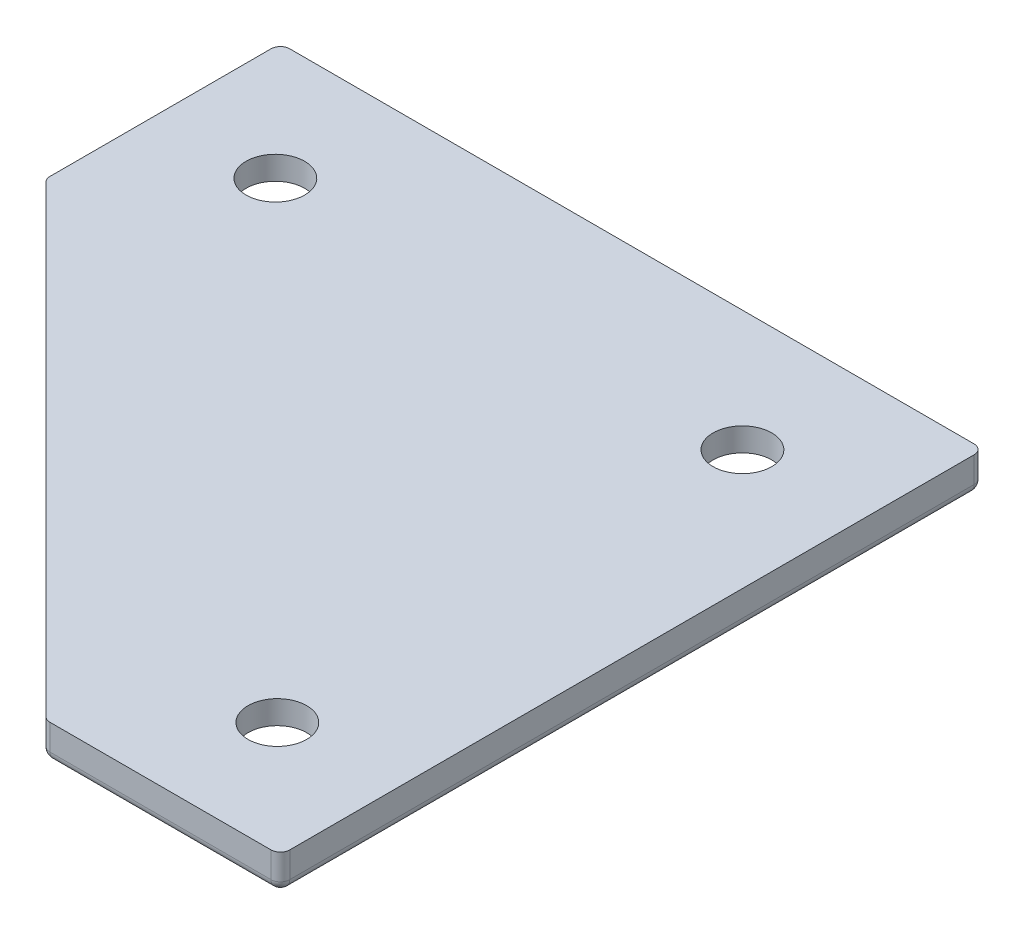
ISO-10303-21;
HEADER;
FILE_DESCRIPTION(('STEP AP214'),'2;1');
FILE_NAME('part.step','',(''),(''),'','','');
FILE_SCHEMA(('AUTOMOTIVE_DESIGN { 1 0 10303 214 1 1 1 1 }'));
ENDSEC;
DATA;
#1=APPLICATION_CONTEXT('core data for automotive mechanical design processes');
#2=APPLICATION_PROTOCOL_DEFINITION('international standard','automotive_design',2000,#1);
#3=PRODUCT_CONTEXT('',#1,'mechanical');
#4=PRODUCT('Part','Part','',(#3));
#5=PRODUCT_RELATED_PRODUCT_CATEGORY('part','',(#4));
#6=PRODUCT_DEFINITION_FORMATION('','',#4);
#7=PRODUCT_DEFINITION_CONTEXT('part definition',#1,'design');
#8=PRODUCT_DEFINITION('design','',#6,#7);
#9=PRODUCT_DEFINITION_SHAPE('','',#8);
#10=(LENGTH_UNIT() NAMED_UNIT(*) SI_UNIT(.MILLI.,.METRE.));
#11=(NAMED_UNIT(*) PLANE_ANGLE_UNIT() SI_UNIT($,.RADIAN.));
#12=(NAMED_UNIT(*) SI_UNIT($,.STERADIAN.) SOLID_ANGLE_UNIT());
#13=UNCERTAINTY_MEASURE_WITH_UNIT(LENGTH_MEASURE(1.E-05),#10,'distance_accuracy_value','');
#14=(GEOMETRIC_REPRESENTATION_CONTEXT(3) GLOBAL_UNCERTAINTY_ASSIGNED_CONTEXT((#13)) GLOBAL_UNIT_ASSIGNED_CONTEXT((#10,
#11,#12)) REPRESENTATION_CONTEXT('',''));
#15=CARTESIAN_POINT('',(0.,0.,0.));
#16=DIRECTION('',(0.,0.,1.));
#17=DIRECTION('',(1.,0.,0.));
#18=AXIS2_PLACEMENT_3D('',#15,#16,#17);
#19=CARTESIAN_POINT('',(12.941413138682,0.,-19.4540886632808));
#20=DIRECTION('',(0.,-1.,0.));
#21=DIRECTION('',(1.,0.,0.));
#22=AXIS2_PLACEMENT_3D('',#19,#20,#21);
#23=CYLINDRICAL_SURFACE('',#22,2.5);
#24=CARTESIAN_POINT('',(12.941413138682,0.,-19.4540886632808));
#25=DIRECTION('',(0.,-1.,0.));
#26=DIRECTION('',(1.,0.,0.));
#27=AXIS2_PLACEMENT_3D('',#24,#25,#26);
#28=CIRCLE('',#27,2.5);
#29=CARTESIAN_POINT('',(15.441413138682,0.,-19.4540886632808));
#30=VERTEX_POINT('',#29);
#31=EDGE_CURVE('E11',#30,#30,#28,.T.);
#32=ORIENTED_EDGE('',*,*,#31,.F.);
#33=EDGE_LOOP('',(#32));
#34=FACE_BOUND('',#33,.T.);
#35=CARTESIAN_POINT('',(12.941413138682,-2.,-19.4540886632808));
#36=DIRECTION('',(0.,-1.,0.));
#37=DIRECTION('',(1.,0.,0.));
#38=AXIS2_PLACEMENT_3D('',#35,#36,#37);
#39=CIRCLE('',#38,2.5);
#40=CARTESIAN_POINT('',(15.441413138682,-2.,-19.4540886632808));
#41=VERTEX_POINT('',#40);
#42=EDGE_CURVE('E24',#41,#41,#39,.T.);
#43=ORIENTED_EDGE('',*,*,#42,.T.);
#44=EDGE_LOOP('',(#43));
#45=FACE_BOUND('',#44,.T.);
#46=ADVANCED_FACE('F17',(#34,#45),#23,.F.);
#47=CARTESIAN_POINT('',(52.9409032156974,0.,-19.3106041997538));
#48=DIRECTION('',(0.,-1.,0.));
#49=DIRECTION('',(1.,0.,0.));
#50=AXIS2_PLACEMENT_3D('',#47,#48,#49);
#51=CYLINDRICAL_SURFACE('',#50,2.5);
#52=CARTESIAN_POINT('',(52.9409032156974,0.,-19.3106041997538));
#53=DIRECTION('',(0.,-1.,0.));
#54=DIRECTION('',(1.,0.,0.));
#55=AXIS2_PLACEMENT_3D('',#52,#53,#54);
#56=CIRCLE('',#55,2.5);
#57=CARTESIAN_POINT('',(55.4409032156974,0.,-19.3106041997538));
#58=VERTEX_POINT('',#57);
#59=EDGE_CURVE('E201',#58,#58,#56,.T.);
#60=ORIENTED_EDGE('',*,*,#59,.F.);
#61=EDGE_LOOP('',(#60));
#62=FACE_BOUND('',#61,.T.);
#63=CARTESIAN_POINT('',(52.9409032156974,-2.,-19.3106041997538));
#64=DIRECTION('',(0.,-1.,0.));
#65=DIRECTION('',(1.,0.,0.));
#66=AXIS2_PLACEMENT_3D('',#63,#64,#65);
#67=CIRCLE('',#66,2.5);
#68=CARTESIAN_POINT('',(55.4409032156974,-2.,-19.3106041997538));
#69=VERTEX_POINT('',#68);
#70=EDGE_CURVE('E198',#69,#69,#67,.T.);
#71=ORIENTED_EDGE('',*,*,#70,.T.);
#72=EDGE_LOOP('',(#71));
#73=FACE_BOUND('',#72,.T.);
#74=ADVANCED_FACE('F333',(#62,#73),#51,.F.);
#75=CARTESIAN_POINT('',(53.2561390023041,0.,20.6893958002462));
#76=DIRECTION('',(0.,-1.,0.));
#77=DIRECTION('',(1.,0.,0.));
#78=AXIS2_PLACEMENT_3D('',#75,#76,#77);
#79=CYLINDRICAL_SURFACE('',#78,2.5);
#80=CARTESIAN_POINT('',(53.2561390023041,0.,20.6893958002462));
#81=DIRECTION('',(0.,-1.,0.));
#82=DIRECTION('',(1.,0.,0.));
#83=AXIS2_PLACEMENT_3D('',#80,#81,#82);
#84=CIRCLE('',#83,2.5);
#85=CARTESIAN_POINT('',(55.7561390023041,0.,20.6893958002462));
#86=VERTEX_POINT('',#85);
#87=EDGE_CURVE('E195',#86,#86,#84,.T.);
#88=ORIENTED_EDGE('',*,*,#87,.F.);
#89=EDGE_LOOP('',(#88));
#90=FACE_BOUND('',#89,.T.);
#91=CARTESIAN_POINT('',(53.2561390023041,-2.,20.6893958002462));
#92=DIRECTION('',(0.,-1.,0.));
#93=DIRECTION('',(1.,0.,0.));
#94=AXIS2_PLACEMENT_3D('',#91,#92,#93);
#95=CIRCLE('',#94,2.5);
#96=CARTESIAN_POINT('',(55.7561390023041,-2.,20.6893958002462));
#97=VERTEX_POINT('',#96);
#98=EDGE_CURVE('E192',#97,#97,#95,.T.);
#99=ORIENTED_EDGE('',*,*,#98,.T.);
#100=EDGE_LOOP('',(#99));
#101=FACE_BOUND('',#100,.T.);
#102=ADVANCED_FACE('F330',(#90,#101),#79,.F.);
#103=CARTESIAN_POINT('',(63.1954992182265,-3.,30.3719008264463));
#104=DIRECTION('',(0.,0.,-1.));
#105=DIRECTION('',(1.,0.,0.));
#106=AXIS2_PLACEMENT_3D('',#103,#104,#105);
#107=PLANE('',#106);
#108=DIRECTION('',(-1.,0.,0.));
#109=VECTOR('',#108,1.);
#110=CARTESIAN_POINT('',(63.1954992182265,0.,30.3719008264463));
#111=LINE('',#110,#109);
#112=CARTESIAN_POINT('',(62.3954992182265,0.,30.3719008264463));
#113=VERTEX_POINT('',#112);
#114=CARTESIAN_POINT('',(43.526870068125,0.,30.3719008264463));
#115=VERTEX_POINT('',#114);
#116=EDGE_CURVE('E31',#113,#115,#111,.T.);
#117=ORIENTED_EDGE('',*,*,#116,.T.);
#118=DIRECTION('',(0.,1.,0.));
#119=VECTOR('',#118,1.);
#120=CARTESIAN_POINT('',(43.526870068125,-3.,30.3719008264463));
#121=LINE('',#120,#119);
#122=CARTESIAN_POINT('',(43.526870068125,-2.2,30.3719008264463));
#123=VERTEX_POINT('',#122);
#124=EDGE_CURVE('E36',#115,#123,#121,.F.);
#125=ORIENTED_EDGE('',*,*,#124,.T.);
#126=DIRECTION('',(-1.,0.,0.));
#127=VECTOR('',#126,1.);
#128=CARTESIAN_POINT('',(63.1954992182265,-2.2,30.3719008264463));
#129=LINE('',#128,#127);
#130=CARTESIAN_POINT('',(62.3954992182265,-2.2,30.3719008264463));
#131=VERTEX_POINT('',#130);
#132=EDGE_CURVE('E188',#123,#131,#129,.F.);
#133=ORIENTED_EDGE('',*,*,#132,.T.);
#134=DIRECTION('',(0.,1.,0.));
#135=VECTOR('',#134,1.);
#136=CARTESIAN_POINT('',(62.3954992182265,-3.,30.3719008264463));
#137=LINE('',#136,#135);
#138=EDGE_CURVE('E186',#131,#113,#137,.T.);
#139=ORIENTED_EDGE('',*,*,#138,.T.);
#140=EDGE_LOOP('',(#117,#125,#133,#139));
#141=FACE_BOUND('',#140,.T.);
#142=ADVANCED_FACE('F306',(#141),#107,.F.);
#143=CARTESIAN_POINT('',(43.1954992182265,-3.,30.3719008264463));
#144=DIRECTION('',(0.707106781186547,0.,-0.707106781186547));
#145=DIRECTION('',(0.707106781186548,0.,0.707106781186548));
#146=AXIS2_PLACEMENT_3D('',#143,#144,#145);
#147=PLANE('',#146);
#148=DIRECTION('',(-0.707106781186548,0.,-0.707106781186548));
#149=VECTOR('',#148,1.);
#150=CARTESIAN_POINT('',(43.1954992182265,-2.2,30.3719008264463));
#151=LINE('',#150,#149);
#152=CARTESIAN_POINT('',(3.42981379327726,-2.2,-9.39378459850293));
#153=VERTEX_POINT('',#152);
#154=CARTESIAN_POINT('',(42.9611846431757,-2.2,30.1375862513956));
#155=VERTEX_POINT('',#154);
#156=EDGE_CURVE('E184',#153,#155,#151,.F.);
#157=ORIENTED_EDGE('',*,*,#156,.T.);
#158=DIRECTION('',(0.,1.,0.));
#159=VECTOR('',#158,1.);
#160=CARTESIAN_POINT('',(42.9611846431757,-3.,30.1375862513956));
#161=LINE('',#160,#159);
#162=CARTESIAN_POINT('',(42.9611846431757,0.,30.1375862513956));
#163=VERTEX_POINT('',#162);
#164=EDGE_CURVE('E182',#155,#163,#161,.T.);
#165=ORIENTED_EDGE('',*,*,#164,.T.);
#166=DIRECTION('',(-0.707106781186548,0.,-0.707106781186548));
#167=VECTOR('',#166,1.);
#168=CARTESIAN_POINT('',(43.1954992182265,0.,30.3719008264463));
#169=LINE('',#168,#167);
#170=CARTESIAN_POINT('',(3.42981379327721,0.,-9.39378459850299));
#171=VERTEX_POINT('',#170);
#172=EDGE_CURVE('E180',#163,#171,#169,.T.);
#173=ORIENTED_EDGE('',*,*,#172,.T.);
#174=DIRECTION('',(0.,1.,0.));
#175=VECTOR('',#174,1.);
#176=CARTESIAN_POINT('',(3.42981379327726,-3.,-9.39378459850294));
#177=LINE('',#176,#175);
#178=EDGE_CURVE('E178',#171,#153,#177,.F.);
#179=ORIENTED_EDGE('',*,*,#178,.T.);
#180=EDGE_LOOP('',(#157,#165,#173,#179));
#181=FACE_BOUND('',#180,.T.);
#182=ADVANCED_FACE('F321',(#181),#147,.F.);
#183=CARTESIAN_POINT('',(3.1954992182265,-3.,-29.6280991735537));
#184=DIRECTION('',(1.,0.,0.));
#185=DIRECTION('',(0.,1.,0.));
#186=AXIS2_PLACEMENT_3D('',#183,#184,#185);
#187=PLANE('',#186);
#188=CARTESIAN_POINT('',(3.1954992182265,-2.2,-10.7594700234522));
#189=DIRECTION('',(1.,0.,0.));
#190=DIRECTION('',(0.,0.,-1.));
#191=AXIS2_PLACEMENT_3D('',#188,#189,#190);
#192=ELLIPSE('',#191,1.13137084989848,0.8);
#193=CARTESIAN_POINT('',(3.1954992182265,-3.,-10.7594700234522));
#194=VERTEX_POINT('',#193);
#195=CARTESIAN_POINT('',(3.1954992182265,-2.76568542494924,-9.95947002345218));
#196=VERTEX_POINT('',#195);
#197=EDGE_CURVE('E176',#194,#196,#192,.F.);
#198=ORIENTED_EDGE('',*,*,#197,.T.);
#199=DIRECTION('',(0.,1.,0.));
#200=VECTOR('',#199,1.);
#201=CARTESIAN_POINT('',(3.1954992182265,-3.,-9.95947002345218));
#202=LINE('',#201,#200);
#203=CARTESIAN_POINT('',(3.1954992182265,0.,-9.95947002345218));
#204=VERTEX_POINT('',#203);
#205=EDGE_CURVE('E174',#196,#204,#202,.T.);
#206=ORIENTED_EDGE('',*,*,#205,.T.);
#207=DIRECTION('',(0.,0.,-1.));
#208=VECTOR('',#207,1.);
#209=CARTESIAN_POINT('',(3.1954992182265,0.,-29.6280991735537));
#210=LINE('',#209,#208);
#211=CARTESIAN_POINT('',(3.1954992182265,0.,-28.8280991735537));
#212=VERTEX_POINT('',#211);
#213=EDGE_CURVE('E172',#204,#212,#210,.T.);
#214=ORIENTED_EDGE('',*,*,#213,.T.);
#215=DIRECTION('',(0.,1.,0.));
#216=VECTOR('',#215,1.);
#217=CARTESIAN_POINT('',(3.1954992182265,-3.,-28.8280991735537));
#218=LINE('',#217,#216);
#219=CARTESIAN_POINT('',(3.1954992182265,-3.,-28.8280991735537));
#220=VERTEX_POINT('',#219);
#221=EDGE_CURVE('E170',#212,#220,#218,.F.);
#222=ORIENTED_EDGE('',*,*,#221,.T.);
#223=DIRECTION('',(0.,0.,-1.));
#224=VECTOR('',#223,1.);
#225=CARTESIAN_POINT('',(3.1954992182265,-3.,-29.6280991735537));
#226=LINE('',#225,#224);
#227=EDGE_CURVE('E168',#194,#220,#226,.T.);
#228=ORIENTED_EDGE('',*,*,#227,.F.);
#229=EDGE_LOOP('',(#198,#206,#214,#222,#228));
#230=FACE_BOUND('',#229,.T.);
#231=ADVANCED_FACE('F314',(#230),#187,.F.);
#232=CARTESIAN_POINT('',(63.1954992182265,-3.,-29.6280991735537));
#233=DIRECTION('',(0.,0.,1.));
#234=DIRECTION('',(-1.,0.,0.));
#235=AXIS2_PLACEMENT_3D('',#232,#233,#234);
#236=PLANE('',#235);
#237=DIRECTION('',(1.,0.,0.));
#238=VECTOR('',#237,1.);
#239=CARTESIAN_POINT('',(63.1954992182265,-2.2,-29.6280991735537));
#240=LINE('',#239,#238);
#241=CARTESIAN_POINT('',(62.3954992182265,-2.2,-29.6280991735537));
#242=VERTEX_POINT('',#241);
#243=CARTESIAN_POINT('',(3.9954992182265,-2.2,-29.6280991735537));
#244=VERTEX_POINT('',#243);
#245=EDGE_CURVE('E166',#242,#244,#240,.F.);
#246=ORIENTED_EDGE('',*,*,#245,.T.);
#247=DIRECTION('',(0.,1.,0.));
#248=VECTOR('',#247,1.);
#249=CARTESIAN_POINT('',(3.9954992182265,-3.,-29.6280991735537));
#250=LINE('',#249,#248);
#251=CARTESIAN_POINT('',(3.9954992182265,0.,-29.6280991735537));
#252=VERTEX_POINT('',#251);
#253=EDGE_CURVE('E164',#244,#252,#250,.T.);
#254=ORIENTED_EDGE('',*,*,#253,.T.);
#255=DIRECTION('',(1.,0.,0.));
#256=VECTOR('',#255,1.);
#257=CARTESIAN_POINT('',(63.1954992182265,0.,-29.6280991735537));
#258=LINE('',#257,#256);
#259=CARTESIAN_POINT('',(62.3954992182265,0.,-29.6280991735537));
#260=VERTEX_POINT('',#259);
#261=EDGE_CURVE('E162',#252,#260,#258,.T.);
#262=ORIENTED_EDGE('',*,*,#261,.T.);
#263=DIRECTION('',(0.,1.,0.));
#264=VECTOR('',#263,1.);
#265=CARTESIAN_POINT('',(62.3954992182265,-3.,-29.6280991735537));
#266=LINE('',#265,#264);
#267=EDGE_CURVE('E160',#260,#242,#266,.F.);
#268=ORIENTED_EDGE('',*,*,#267,.T.);
#269=EDGE_LOOP('',(#246,#254,#262,#268));
#270=FACE_BOUND('',#269,.T.);
#271=ADVANCED_FACE('F292',(#270),#236,.F.);
#272=CARTESIAN_POINT('',(63.1954992182265,-3.,30.3719008264463));
#273=DIRECTION('',(-1.,0.,0.));
#274=DIRECTION('',(0.,-1.,0.));
#275=AXIS2_PLACEMENT_3D('',#272,#273,#274);
#276=PLANE('',#275);
#277=DIRECTION('',(0.,0.,1.));
#278=VECTOR('',#277,1.);
#279=CARTESIAN_POINT('',(63.1954992182265,0.,30.3719008264463));
#280=LINE('',#279,#278);
#281=CARTESIAN_POINT('',(63.1954992182265,0.,-28.8280991735537));
#282=VERTEX_POINT('',#281);
#283=CARTESIAN_POINT('',(63.1954992182265,0.,29.5719008264463));
#284=VERTEX_POINT('',#283);
#285=EDGE_CURVE('E158',#282,#284,#280,.T.);
#286=ORIENTED_EDGE('',*,*,#285,.T.);
#287=DIRECTION('',(0.,1.,0.));
#288=VECTOR('',#287,1.);
#289=CARTESIAN_POINT('',(63.1954992182265,-3.,29.5719008264463));
#290=LINE('',#289,#288);
#291=CARTESIAN_POINT('',(63.1954992182265,-2.2,29.5719008264463));
#292=VERTEX_POINT('',#291);
#293=EDGE_CURVE('E156',#284,#292,#290,.F.);
#294=ORIENTED_EDGE('',*,*,#293,.T.);
#295=DIRECTION('',(0.,0.,1.));
#296=VECTOR('',#295,1.);
#297=CARTESIAN_POINT('',(63.1954992182265,-2.2,30.3719008264463));
#298=LINE('',#297,#296);
#299=CARTESIAN_POINT('',(63.1954992182265,-2.2,-28.8280991735537));
#300=VERTEX_POINT('',#299);
#301=EDGE_CURVE('E123',#292,#300,#298,.F.);
#302=ORIENTED_EDGE('',*,*,#301,.T.);
#303=DIRECTION('',(0.,1.,0.));
#304=VECTOR('',#303,1.);
#305=CARTESIAN_POINT('',(63.1954992182265,-3.,-28.8280991735537));
#306=LINE('',#305,#304);
#307=EDGE_CURVE('E153',#300,#282,#306,.T.);
#308=ORIENTED_EDGE('',*,*,#307,.T.);
#309=EDGE_LOOP('',(#286,#294,#302,#308));
#310=FACE_BOUND('',#309,.T.);
#311=ADVANCED_FACE('F302',(#310),#276,.F.);
#312=CARTESIAN_POINT('',(0.,-3.,0.));
#313=DIRECTION('',(0.,1.,0.));
#314=DIRECTION('',(-1.,0.,0.));
#315=AXIS2_PLACEMENT_3D('',#312,#313,#314);
#316=PLANE('',#315);
#317=CARTESIAN_POINT('',(53.2561390023041,-3.,20.6893958002462));
#318=DIRECTION('',(0.,1.,0.));
#319=DIRECTION('',(0.,0.,1.));
#320=AXIS2_PLACEMENT_3D('',#317,#318,#319);
#321=CIRCLE('',#320,5.05);
#322=CARTESIAN_POINT('',(53.2561390023041,-3.,25.7393958002462));
#323=VERTEX_POINT('',#322);
#324=EDGE_CURVE('E150',#323,#323,#321,.T.);
#325=ORIENTED_EDGE('',*,*,#324,.T.);
#326=EDGE_LOOP('',(#325));
#327=FACE_BOUND('',#326,.T.);
#328=CARTESIAN_POINT('',(52.9409032156974,-3.,-19.3106041997538));
#329=DIRECTION('',(0.,1.,0.));
#330=DIRECTION('',(0.,0.,1.));
#331=AXIS2_PLACEMENT_3D('',#328,#329,#330);
#332=CIRCLE('',#331,5.05);
#333=CARTESIAN_POINT('',(52.9409032156974,-3.,-14.2606041997538));
#334=VERTEX_POINT('',#333);
#335=EDGE_CURVE('E143',#334,#334,#332,.T.);
#336=ORIENTED_EDGE('',*,*,#335,.T.);
#337=EDGE_LOOP('',(#336));
#338=FACE_BOUND('',#337,.T.);
#339=CARTESIAN_POINT('',(12.941413138682,-3.,-19.4540886632808));
#340=DIRECTION('',(0.,1.,0.));
#341=DIRECTION('',(0.,0.,1.));
#342=AXIS2_PLACEMENT_3D('',#339,#340,#341);
#343=CIRCLE('',#342,5.05);
#344=CARTESIAN_POINT('',(12.941413138682,-3.,-14.4040886632808));
#345=VERTEX_POINT('',#344);
#346=EDGE_CURVE('E139',#345,#345,#343,.T.);
#347=ORIENTED_EDGE('',*,*,#346,.T.);
#348=EDGE_LOOP('',(#347));
#349=FACE_BOUND('',#348,.T.);
#350=DIRECTION('',(-1.,0.,0.));
#351=VECTOR('',#350,1.);
#352=CARTESIAN_POINT('',(0.,-3.,29.5719008264463));
#353=LINE('',#352,#351);
#354=CARTESIAN_POINT('',(62.3954992182265,-3.,29.5719008264463));
#355=VERTEX_POINT('',#354);
#356=CARTESIAN_POINT('',(43.526870068125,-3.,29.5719008264463));
#357=VERTEX_POINT('',#356);
#358=EDGE_CURVE('E108',#355,#357,#353,.T.);
#359=ORIENTED_EDGE('',*,*,#358,.T.);
#360=DIRECTION('',(-0.707106781186548,0.,-0.707106781186548));
#361=VECTOR('',#360,1.);
#362=CARTESIAN_POINT('',(6.97748462083934,-3.,-6.97748462083934));
#363=LINE('',#362,#361);
#364=EDGE_CURVE('E140',#357,#194,#363,.T.);
#365=ORIENTED_EDGE('',*,*,#364,.T.);
#366=ORIENTED_EDGE('',*,*,#227,.T.);
#367=DIRECTION('',(1.,0.,0.));
#368=VECTOR('',#367,1.);
#369=CARTESIAN_POINT('',(0.,-3.,-28.8280991735537));
#370=LINE('',#369,#368);
#371=CARTESIAN_POINT('',(62.3954992182265,-3.,-28.8280991735537));
#372=VERTEX_POINT('',#371);
#373=EDGE_CURVE('E112',#220,#372,#370,.T.);
#374=ORIENTED_EDGE('',*,*,#373,.T.);
#375=DIRECTION('',(0.,0.,1.));
#376=VECTOR('',#375,1.);
#377=CARTESIAN_POINT('',(62.3954992182265,-3.,0.));
#378=LINE('',#377,#376);
#379=EDGE_CURVE('E103',#372,#355,#378,.T.);
#380=ORIENTED_EDGE('',*,*,#379,.T.);
#381=EDGE_LOOP('',(#359,#365,#366,#374,#380));
#382=FACE_BOUND('',#381,.T.);
#383=ADVANCED_FACE('F105',(#327,#338,#349,#382),#316,.F.);
#384=CARTESIAN_POINT('',(0.,0.,0.));
#385=DIRECTION('',(0.,1.,0.));
#386=DIRECTION('',(-1.,0.,0.));
#387=AXIS2_PLACEMENT_3D('',#384,#385,#386);
#388=PLANE('',#387);
#389=ORIENTED_EDGE('',*,*,#87,.T.);
#390=EDGE_LOOP('',(#389));
#391=FACE_BOUND('',#390,.T.);
#392=ORIENTED_EDGE('',*,*,#59,.T.);
#393=EDGE_LOOP('',(#392));
#394=FACE_BOUND('',#393,.T.);
#395=ORIENTED_EDGE('',*,*,#31,.T.);
#396=EDGE_LOOP('',(#395));
#397=FACE_BOUND('',#396,.T.);
#398=ORIENTED_EDGE('',*,*,#172,.F.);
#399=CARTESIAN_POINT('',(43.526870068125,0.,29.5719008264463));
#400=DIRECTION('',(0.,1.,0.));
#401=DIRECTION('',(0.,0.,1.));
#402=AXIS2_PLACEMENT_3D('',#399,#400,#401);
#403=CIRCLE('',#402,0.8);
#404=EDGE_CURVE('E116',#163,#115,#403,.T.);
#405=ORIENTED_EDGE('',*,*,#404,.T.);
#406=ORIENTED_EDGE('',*,*,#116,.F.);
#407=CARTESIAN_POINT('',(62.3954992182265,0.,29.5719008264463));
#408=DIRECTION('',(0.,1.,0.));
#409=DIRECTION('',(0.,0.,1.));
#410=AXIS2_PLACEMENT_3D('',#407,#408,#409);
#411=CIRCLE('',#410,0.8);
#412=EDGE_CURVE('E248',#113,#284,#411,.T.);
#413=ORIENTED_EDGE('',*,*,#412,.T.);
#414=ORIENTED_EDGE('',*,*,#285,.F.);
#415=CARTESIAN_POINT('',(62.3954992182265,0.,-28.8280991735537));
#416=DIRECTION('',(0.,1.,0.));
#417=DIRECTION('',(0.,0.,1.));
#418=AXIS2_PLACEMENT_3D('',#415,#416,#417);
#419=CIRCLE('',#418,0.8);
#420=EDGE_CURVE('E245',#282,#260,#419,.T.);
#421=ORIENTED_EDGE('',*,*,#420,.T.);
#422=ORIENTED_EDGE('',*,*,#261,.F.);
#423=CARTESIAN_POINT('',(3.9954992182265,0.,-28.8280991735537));
#424=DIRECTION('',(0.,1.,0.));
#425=DIRECTION('',(0.,0.,1.));
#426=AXIS2_PLACEMENT_3D('',#423,#424,#425);
#427=CIRCLE('',#426,0.8);
#428=EDGE_CURVE('E242',#252,#212,#427,.T.);
#429=ORIENTED_EDGE('',*,*,#428,.T.);
#430=ORIENTED_EDGE('',*,*,#213,.F.);
#431=CARTESIAN_POINT('',(3.9954992182265,0.,-9.95947002345218));
#432=DIRECTION('',(0.,1.,0.));
#433=DIRECTION('',(0.,0.,1.));
#434=AXIS2_PLACEMENT_3D('',#431,#432,#433);
#435=CIRCLE('',#434,0.8);
#436=EDGE_CURVE('E239',#204,#171,#435,.T.);
#437=ORIENTED_EDGE('',*,*,#436,.T.);
#438=EDGE_LOOP('',(#398,#405,#406,#413,#414,#421,#422,#429,#430,#437));
#439=FACE_BOUND('',#438,.T.);
#440=ADVANCED_FACE('F254',(#391,#394,#397,#439),#388,.T.);
#441=CARTESIAN_POINT('',(53.2561390023041,-2.,20.6893958002462));
#442=DIRECTION('',(0.,-1.,0.));
#443=DIRECTION('',(0.,0.,-1.));
#444=AXIS2_PLACEMENT_3D('',#441,#442,#443);
#445=CYLINDRICAL_SURFACE('',#444,4.25);
#446=CARTESIAN_POINT('',(53.2561390023041,-2.2,20.6893958002462));
#447=DIRECTION('',(0.,1.,0.));
#448=DIRECTION('',(0.,0.,1.));
#449=AXIS2_PLACEMENT_3D('',#446,#447,#448);
#450=CIRCLE('',#449,4.25);
#451=CARTESIAN_POINT('',(53.2561390023041,-2.2,24.9393958002462));
#452=VERTEX_POINT('',#451);
#453=EDGE_CURVE('E236',#452,#452,#450,.F.);
#454=ORIENTED_EDGE('',*,*,#453,.T.);
#455=EDGE_LOOP('',(#454));
#456=FACE_BOUND('',#455,.T.);
#457=CARTESIAN_POINT('',(53.2561390023041,-2.,20.6893958002462));
#458=DIRECTION('',(0.,-1.,0.));
#459=DIRECTION('',(0.,0.,-1.));
#460=AXIS2_PLACEMENT_3D('',#457,#458,#459);
#461=CIRCLE('',#460,4.25);
#462=CARTESIAN_POINT('',(53.2561390023041,-2.,16.4393958002462));
#463=VERTEX_POINT('',#462);
#464=EDGE_CURVE('E233',#463,#463,#461,.T.);
#465=ORIENTED_EDGE('',*,*,#464,.F.);
#466=EDGE_LOOP('',(#465));
#467=FACE_BOUND('',#466,.T.);
#468=ADVANCED_FACE('F343',(#456,#467),#445,.F.);
#469=CARTESIAN_POINT('',(33.1954992182265,-2.,0.371900826446302));
#470=DIRECTION('',(0.,-1.,0.));
#471=DIRECTION('',(1.,0.,0.));
#472=AXIS2_PLACEMENT_3D('',#469,#470,#471);
#473=PLANE('',#472);
#474=ORIENTED_EDGE('',*,*,#98,.F.);
#475=EDGE_LOOP('',(#474));
#476=FACE_BOUND('',#475,.T.);
#477=ORIENTED_EDGE('',*,*,#464,.T.);
#478=EDGE_LOOP('',(#477));
#479=FACE_BOUND('',#478,.T.);
#480=ADVANCED_FACE('F350',(#476,#479),#473,.T.);
#481=CARTESIAN_POINT('',(52.9409032156974,-2.,-19.3106041997538));
#482=DIRECTION('',(0.,-1.,0.));
#483=DIRECTION('',(0.,0.,-1.));
#484=AXIS2_PLACEMENT_3D('',#481,#482,#483);
#485=CYLINDRICAL_SURFACE('',#484,4.25);
#486=CARTESIAN_POINT('',(52.9409032156974,-2.2,-19.3106041997538));
#487=DIRECTION('',(0.,1.,0.));
#488=DIRECTION('',(0.,0.,1.));
#489=AXIS2_PLACEMENT_3D('',#486,#487,#488);
#490=CIRCLE('',#489,4.25);
#491=CARTESIAN_POINT('',(52.9409032156974,-2.2,-15.0606041997538));
#492=VERTEX_POINT('',#491);
#493=EDGE_CURVE('E230',#492,#492,#490,.F.);
#494=ORIENTED_EDGE('',*,*,#493,.T.);
#495=EDGE_LOOP('',(#494));
#496=FACE_BOUND('',#495,.T.);
#497=CARTESIAN_POINT('',(52.9409032156974,-2.,-19.3106041997538));
#498=DIRECTION('',(0.,-1.,0.));
#499=DIRECTION('',(0.,0.,-1.));
#500=AXIS2_PLACEMENT_3D('',#497,#498,#499);
#501=CIRCLE('',#500,4.25);
#502=CARTESIAN_POINT('',(52.9409032156974,-2.,-23.5606041997538));
#503=VERTEX_POINT('',#502);
#504=EDGE_CURVE('E221',#503,#503,#501,.T.);
#505=ORIENTED_EDGE('',*,*,#504,.F.);
#506=EDGE_LOOP('',(#505));
#507=FACE_BOUND('',#506,.T.);
#508=ADVANCED_FACE('F401',(#496,#507),#485,.F.);
#509=CARTESIAN_POINT('',(33.1954992182265,-2.,0.371900826446302));
#510=DIRECTION('',(0.,-1.,0.));
#511=DIRECTION('',(1.,0.,0.));
#512=AXIS2_PLACEMENT_3D('',#509,#510,#511);
#513=PLANE('',#512);
#514=ORIENTED_EDGE('',*,*,#70,.F.);
#515=EDGE_LOOP('',(#514));
#516=FACE_BOUND('',#515,.T.);
#517=ORIENTED_EDGE('',*,*,#504,.T.);
#518=EDGE_LOOP('',(#517));
#519=FACE_BOUND('',#518,.T.);
#520=ADVANCED_FACE('F410',(#516,#519),#513,.T.);
#521=CARTESIAN_POINT('',(12.941413138682,-2.,-19.4540886632808));
#522=DIRECTION('',(0.,-1.,0.));
#523=DIRECTION('',(0.,0.,-1.));
#524=AXIS2_PLACEMENT_3D('',#521,#522,#523);
#525=CYLINDRICAL_SURFACE('',#524,4.25);
#526=CARTESIAN_POINT('',(12.941413138682,-2.2,-19.4540886632808));
#527=DIRECTION('',(0.,1.,0.));
#528=DIRECTION('',(0.,0.,1.));
#529=AXIS2_PLACEMENT_3D('',#526,#527,#528);
#530=CIRCLE('',#529,4.25);
#531=CARTESIAN_POINT('',(12.941413138682,-2.2,-15.2040886632808));
#532=VERTEX_POINT('',#531);
#533=EDGE_CURVE('E217',#532,#532,#530,.F.);
#534=ORIENTED_EDGE('',*,*,#533,.T.);
#535=EDGE_LOOP('',(#534));
#536=FACE_BOUND('',#535,.T.);
#537=CARTESIAN_POINT('',(12.941413138682,-2.,-19.4540886632808));
#538=DIRECTION('',(0.,-1.,0.));
#539=DIRECTION('',(0.,0.,-1.));
#540=AXIS2_PLACEMENT_3D('',#537,#538,#539);
#541=CIRCLE('',#540,4.25);
#542=CARTESIAN_POINT('',(12.941413138682,-2.,-23.7040886632808));
#543=VERTEX_POINT('',#542);
#544=EDGE_CURVE('E215',#543,#543,#541,.T.);
#545=ORIENTED_EDGE('',*,*,#544,.F.);
#546=EDGE_LOOP('',(#545));
#547=FACE_BOUND('',#546,.T.);
#548=ADVANCED_FACE('F211',(#536,#547),#525,.F.);
#549=CARTESIAN_POINT('',(33.1954992182265,-2.,0.371900826446302));
#550=DIRECTION('',(0.,-1.,0.));
#551=DIRECTION('',(1.,0.,0.));
#552=AXIS2_PLACEMENT_3D('',#549,#550,#551);
#553=PLANE('',#552);
#554=ORIENTED_EDGE('',*,*,#42,.F.);
#555=EDGE_LOOP('',(#554));
#556=FACE_BOUND('',#555,.T.);
#557=ORIENTED_EDGE('',*,*,#544,.T.);
#558=EDGE_LOOP('',(#557));
#559=FACE_BOUND('',#558,.T.);
#560=ADVANCED_FACE('F207',(#556,#559),#553,.T.);
#561=CARTESIAN_POINT('',(3.9954992182265,-3.,-28.8280991735537));
#562=DIRECTION('',(0.,1.,0.));
#563=DIRECTION('',(0.,0.,1.));
#564=AXIS2_PLACEMENT_3D('',#561,#562,#563);
#565=CYLINDRICAL_SURFACE('',#564,0.8);
#566=ORIENTED_EDGE('',*,*,#428,.F.);
#567=ORIENTED_EDGE('',*,*,#253,.F.);
#568=CARTESIAN_POINT('',(3.9954992182265,-2.2,-28.8280991735537));
#569=DIRECTION('',(0.707106781186548,-0.707106781186548,0.));
#570=DIRECTION('',(0.707106781186548,0.707106781186548,0.));
#571=AXIS2_PLACEMENT_3D('',#568,#569,#570);
#572=ELLIPSE('',#571,1.13137084989848,0.8);
#573=EDGE_CURVE('E218',#220,#244,#572,.T.);
#574=ORIENTED_EDGE('',*,*,#573,.F.);
#575=ORIENTED_EDGE('',*,*,#221,.F.);
#576=EDGE_LOOP('',(#566,#567,#574,#575));
#577=FACE_BOUND('',#576,.T.);
#578=ADVANCED_FACE('F210',(#577),#565,.T.);
#579=CARTESIAN_POINT('',(62.3954992182265,-3.,-28.8280991735537));
#580=DIRECTION('',(0.,1.,0.));
#581=DIRECTION('',(0.,0.,1.));
#582=AXIS2_PLACEMENT_3D('',#579,#580,#581);
#583=CYLINDRICAL_SURFACE('',#582,0.8);
#584=ORIENTED_EDGE('',*,*,#420,.F.);
#585=ORIENTED_EDGE('',*,*,#307,.F.);
#586=CARTESIAN_POINT('',(62.3954992182265,-2.2,-28.8280991735537));
#587=DIRECTION('',(0.,-1.,0.));
#588=DIRECTION('',(0.,0.,-1.));
#589=AXIS2_PLACEMENT_3D('',#586,#587,#588);
#590=CIRCLE('',#589,0.8);
#591=EDGE_CURVE('E224',#242,#300,#590,.T.);
#592=ORIENTED_EDGE('',*,*,#591,.F.);
#593=ORIENTED_EDGE('',*,*,#267,.F.);
#594=EDGE_LOOP('',(#584,#585,#592,#593));
#595=FACE_BOUND('',#594,.T.);
#596=ADVANCED_FACE('F286',(#595),#583,.T.);
#597=CARTESIAN_POINT('',(0.,-2.2,-28.8280991735537));
#598=DIRECTION('',(1.,0.,0.));
#599=DIRECTION('',(0.,0.,-1.));
#600=AXIS2_PLACEMENT_3D('',#597,#598,#599);
#601=CYLINDRICAL_SURFACE('',#600,0.8);
#602=ORIENTED_EDGE('',*,*,#573,.T.);
#603=ORIENTED_EDGE('',*,*,#245,.F.);
#604=CARTESIAN_POINT('',(62.3954992182265,-2.2,-28.8280991735537));
#605=DIRECTION('',(1.,0.,0.));
#606=DIRECTION('',(0.,0.,-1.));
#607=AXIS2_PLACEMENT_3D('',#604,#605,#606);
#608=CIRCLE('',#607,0.8);
#609=EDGE_CURVE('E274',#372,#242,#608,.T.);
#610=ORIENTED_EDGE('',*,*,#609,.F.);
#611=ORIENTED_EDGE('',*,*,#373,.F.);
#612=EDGE_LOOP('',(#602,#603,#610,#611));
#613=FACE_BOUND('',#612,.T.);
#614=ADVANCED_FACE('F288',(#613),#601,.T.);
#615=CARTESIAN_POINT('',(62.3954992182265,-2.2,-28.8280991735537));
#616=DIRECTION('',(0.,0.,-1.));
#617=DIRECTION('',(-1.,0.,0.));
#618=AXIS2_PLACEMENT_3D('',#615,#616,#617);
#619=SPHERICAL_SURFACE('',#618,0.8);
#620=ORIENTED_EDGE('',*,*,#609,.T.);
#621=ORIENTED_EDGE('',*,*,#591,.T.);
#622=CARTESIAN_POINT('',(62.3954992182265,-2.2,-28.8280991735537));
#623=DIRECTION('',(0.,0.,-1.));
#624=DIRECTION('',(-1.,0.,0.));
#625=AXIS2_PLACEMENT_3D('',#622,#623,#624);
#626=CIRCLE('',#625,0.8);
#627=EDGE_CURVE('E272',#372,#300,#626,.F.);
#628=ORIENTED_EDGE('',*,*,#627,.F.);
#629=EDGE_LOOP('',(#620,#621,#628));
#630=FACE_BOUND('',#629,.T.);
#631=ADVANCED_FACE('F280',(#630),#619,.T.);
#632=CARTESIAN_POINT('',(62.3954992182265,-3.,29.5719008264463));
#633=DIRECTION('',(0.,1.,0.));
#634=DIRECTION('',(0.,0.,1.));
#635=AXIS2_PLACEMENT_3D('',#632,#633,#634);
#636=CYLINDRICAL_SURFACE('',#635,0.8);
#637=ORIENTED_EDGE('',*,*,#412,.F.);
#638=ORIENTED_EDGE('',*,*,#138,.F.);
#639=CARTESIAN_POINT('',(62.3954992182265,-2.2,29.5719008264463));
#640=DIRECTION('',(0.,-1.,0.));
#641=DIRECTION('',(0.,0.,-1.));
#642=AXIS2_PLACEMENT_3D('',#639,#640,#641);
#643=CIRCLE('',#642,0.8);
#644=EDGE_CURVE('E126',#292,#131,#643,.T.);
#645=ORIENTED_EDGE('',*,*,#644,.F.);
#646=ORIENTED_EDGE('',*,*,#293,.F.);
#647=EDGE_LOOP('',(#637,#638,#645,#646));
#648=FACE_BOUND('',#647,.T.);
#649=ADVANCED_FACE('F305',(#648),#636,.T.);
#650=CARTESIAN_POINT('',(62.3954992182265,-2.2,0.));
#651=DIRECTION('',(0.,0.,1.));
#652=DIRECTION('',(1.,0.,0.));
#653=AXIS2_PLACEMENT_3D('',#650,#651,#652);
#654=CYLINDRICAL_SURFACE('',#653,0.8);
#655=ORIENTED_EDGE('',*,*,#627,.T.);
#656=ORIENTED_EDGE('',*,*,#301,.F.);
#657=CARTESIAN_POINT('',(62.3954992182265,-2.2,29.5719008264463));
#658=DIRECTION('',(0.,0.,1.));
#659=DIRECTION('',(1.,0.,0.));
#660=AXIS2_PLACEMENT_3D('',#657,#658,#659);
#661=CIRCLE('',#660,0.8);
#662=EDGE_CURVE('E120',#355,#292,#661,.T.);
#663=ORIENTED_EDGE('',*,*,#662,.F.);
#664=ORIENTED_EDGE('',*,*,#379,.F.);
#665=EDGE_LOOP('',(#655,#656,#663,#664));
#666=FACE_BOUND('',#665,.T.);
#667=ADVANCED_FACE('F122',(#666),#654,.T.);
#668=CARTESIAN_POINT('',(62.3954992182265,-2.2,29.5719008264463));
#669=DIRECTION('',(1.,0.,0.));
#670=DIRECTION('',(0.,0.,-1.));
#671=AXIS2_PLACEMENT_3D('',#668,#669,#670);
#672=SPHERICAL_SURFACE('',#671,0.8);
#673=ORIENTED_EDGE('',*,*,#662,.T.);
#674=ORIENTED_EDGE('',*,*,#644,.T.);
#675=CARTESIAN_POINT('',(62.3954992182265,-2.2,29.5719008264463));
#676=DIRECTION('',(1.,0.,0.));
#677=DIRECTION('',(0.,0.,-1.));
#678=AXIS2_PLACEMENT_3D('',#675,#676,#677);
#679=CIRCLE('',#678,0.8);
#680=EDGE_CURVE('E127',#355,#131,#679,.F.);
#681=ORIENTED_EDGE('',*,*,#680,.F.);
#682=EDGE_LOOP('',(#673,#674,#681));
#683=FACE_BOUND('',#682,.T.);
#684=ADVANCED_FACE('F130',(#683),#672,.T.);
#685=CARTESIAN_POINT('',(3.9954992182265,-3.,-9.95947002345218));
#686=DIRECTION('',(0.,1.,0.));
#687=DIRECTION('',(0.,0.,1.));
#688=AXIS2_PLACEMENT_3D('',#685,#686,#687);
#689=CYLINDRICAL_SURFACE('',#688,0.8);
#690=ORIENTED_EDGE('',*,*,#436,.F.);
#691=ORIENTED_EDGE('',*,*,#205,.F.);
#692=CARTESIAN_POINT('',(3.9954992182265,-2.2,-9.95947002345218));
#693=DIRECTION('',(-0.5,0.707106781186548,-0.5));
#694=DIRECTION('',(-0.5,-0.707106781186548,-0.5));
#695=AXIS2_PLACEMENT_3D('',#692,#693,#694);
#696=ELLIPSE('',#695,1.13137084989848,0.8);
#697=EDGE_CURVE('E133',#153,#196,#696,.F.);
#698=ORIENTED_EDGE('',*,*,#697,.F.);
#699=ORIENTED_EDGE('',*,*,#178,.F.);
#700=EDGE_LOOP('',(#690,#691,#698,#699));
#701=FACE_BOUND('',#700,.T.);
#702=ADVANCED_FACE('F318',(#701),#689,.T.);
#703=CARTESIAN_POINT('',(0.,-2.2,29.5719008264463));
#704=DIRECTION('',(-1.,0.,0.));
#705=DIRECTION('',(0.,0.,1.));
#706=AXIS2_PLACEMENT_3D('',#703,#704,#705);
#707=CYLINDRICAL_SURFACE('',#706,0.8);
#708=ORIENTED_EDGE('',*,*,#680,.T.);
#709=ORIENTED_EDGE('',*,*,#132,.F.);
#710=CARTESIAN_POINT('',(43.526870068125,-2.2,29.5719008264463));
#711=DIRECTION('',(-1.,0.,0.));
#712=DIRECTION('',(0.,0.,1.));
#713=AXIS2_PLACEMENT_3D('',#710,#711,#712);
#714=CIRCLE('',#713,0.8);
#715=EDGE_CURVE('E137',#357,#123,#714,.T.);
#716=ORIENTED_EDGE('',*,*,#715,.F.);
#717=ORIENTED_EDGE('',*,*,#358,.F.);
#718=EDGE_LOOP('',(#708,#709,#716,#717));
#719=FACE_BOUND('',#718,.T.);
#720=ADVANCED_FACE('F135',(#719),#707,.T.);
#721=CARTESIAN_POINT('',(6.97748462083934,-2.2,-6.97748462083934));
#722=DIRECTION('',(-0.707106781186548,0.,-0.707106781186548));
#723=DIRECTION('',(-0.707106781186548,0.,0.707106781186548));
#724=AXIS2_PLACEMENT_3D('',#721,#722,#723);
#725=CYLINDRICAL_SURFACE('',#724,0.8);
#726=ORIENTED_EDGE('',*,*,#197,.F.);
#727=ORIENTED_EDGE('',*,*,#364,.F.);
#728=CARTESIAN_POINT('',(43.526870068125,-2.2,29.5719008264463));
#729=DIRECTION('',(0.707106781186548,0.,0.707106781186548));
#730=DIRECTION('',(0.707106781186548,0.,-0.707106781186548));
#731=AXIS2_PLACEMENT_3D('',#728,#729,#730);
#732=CIRCLE('',#731,0.8);
#733=EDGE_CURVE('E264',#155,#357,#732,.T.);
#734=ORIENTED_EDGE('',*,*,#733,.F.);
#735=ORIENTED_EDGE('',*,*,#156,.F.);
#736=ORIENTED_EDGE('',*,*,#697,.T.);
#737=EDGE_LOOP('',(#726,#727,#734,#735,#736));
#738=FACE_BOUND('',#737,.T.);
#739=ADVANCED_FACE('F312',(#738),#725,.T.);
#740=CARTESIAN_POINT('',(43.526870068125,-2.2,29.5719008264463));
#741=DIRECTION('',(0.,-1.,0.));
#742=DIRECTION('',(0.,0.,-1.));
#743=AXIS2_PLACEMENT_3D('',#740,#741,#742);
#744=SPHERICAL_SURFACE('',#743,0.8);
#745=ORIENTED_EDGE('',*,*,#733,.T.);
#746=ORIENTED_EDGE('',*,*,#715,.T.);
#747=CARTESIAN_POINT('',(43.526870068125,-2.2,29.5719008264463));
#748=DIRECTION('',(0.,-1.,0.));
#749=DIRECTION('',(0.,0.,-1.));
#750=AXIS2_PLACEMENT_3D('',#747,#748,#749);
#751=CIRCLE('',#750,0.8);
#752=EDGE_CURVE('E261',#155,#123,#751,.F.);
#753=ORIENTED_EDGE('',*,*,#752,.F.);
#754=EDGE_LOOP('',(#745,#746,#753));
#755=FACE_BOUND('',#754,.T.);
#756=ADVANCED_FACE('F307',(#755),#744,.T.);
#757=CARTESIAN_POINT('',(43.526870068125,-3.,29.5719008264463));
#758=DIRECTION('',(0.,1.,0.));
#759=DIRECTION('',(0.,0.,1.));
#760=AXIS2_PLACEMENT_3D('',#757,#758,#759);
#761=CYLINDRICAL_SURFACE('',#760,0.8);
#762=ORIENTED_EDGE('',*,*,#752,.T.);
#763=ORIENTED_EDGE('',*,*,#124,.F.);
#764=ORIENTED_EDGE('',*,*,#404,.F.);
#765=ORIENTED_EDGE('',*,*,#164,.F.);
#766=EDGE_LOOP('',(#762,#763,#764,#765));
#767=FACE_BOUND('',#766,.T.);
#768=ADVANCED_FACE('F259',(#767),#761,.T.);
#769=CARTESIAN_POINT('',(53.2561390023041,-2.2,20.6893958002462));
#770=DIRECTION('',(0.,-1.,0.));
#771=DIRECTION('',(0.,0.,-1.));
#772=AXIS2_PLACEMENT_3D('',#769,#770,#771);
#773=CONICAL_SURFACE('',#772,4.25,0.785398163397448);
#774=ORIENTED_EDGE('',*,*,#324,.F.);
#775=EDGE_LOOP('',(#774));
#776=FACE_BOUND('',#775,.T.);
#777=ORIENTED_EDGE('',*,*,#453,.F.);
#778=EDGE_LOOP('',(#777));
#779=FACE_BOUND('',#778,.T.);
#780=ADVANCED_FACE('F532',(#776,#779),#773,.F.);
#781=CARTESIAN_POINT('',(52.9409032156974,-2.2,-19.3106041997538));
#782=DIRECTION('',(0.,-1.,0.));
#783=DIRECTION('',(0.,0.,-1.));
#784=AXIS2_PLACEMENT_3D('',#781,#782,#783);
#785=CONICAL_SURFACE('',#784,4.25,0.785398163397449);
#786=ORIENTED_EDGE('',*,*,#335,.F.);
#787=EDGE_LOOP('',(#786));
#788=FACE_BOUND('',#787,.T.);
#789=ORIENTED_EDGE('',*,*,#493,.F.);
#790=EDGE_LOOP('',(#789));
#791=FACE_BOUND('',#790,.T.);
#792=ADVANCED_FACE('F541',(#788,#791),#785,.F.);
#793=CARTESIAN_POINT('',(12.941413138682,-2.2,-19.4540886632808));
#794=DIRECTION('',(0.,-1.,0.));
#795=DIRECTION('',(0.,0.,-1.));
#796=AXIS2_PLACEMENT_3D('',#793,#794,#795);
#797=CONICAL_SURFACE('',#796,4.25,0.785398163397449);
#798=ORIENTED_EDGE('',*,*,#346,.F.);
#799=EDGE_LOOP('',(#798));
#800=FACE_BOUND('',#799,.T.);
#801=ORIENTED_EDGE('',*,*,#533,.F.);
#802=EDGE_LOOP('',(#801));
#803=FACE_BOUND('',#802,.T.);
#804=ADVANCED_FACE('F551',(#800,#803),#797,.F.);
#805=CLOSED_SHELL('',(#46,#74,#102,#142,#182,#231,#271,#311,#383,#440,#468,#480,#508,#520,#548,
#560,#578,#596,#614,#631,#649,#667,#684,#702,#720,#739,#756,#768,#780,#792,#804));
#806=MANIFOLD_SOLID_BREP('B1',#805);
#807=ADVANCED_BREP_SHAPE_REPRESENTATION('',(#18,#806),#14);
#808=SHAPE_DEFINITION_REPRESENTATION(#9,#807);
ENDSEC;
END-ISO-10303-21;
